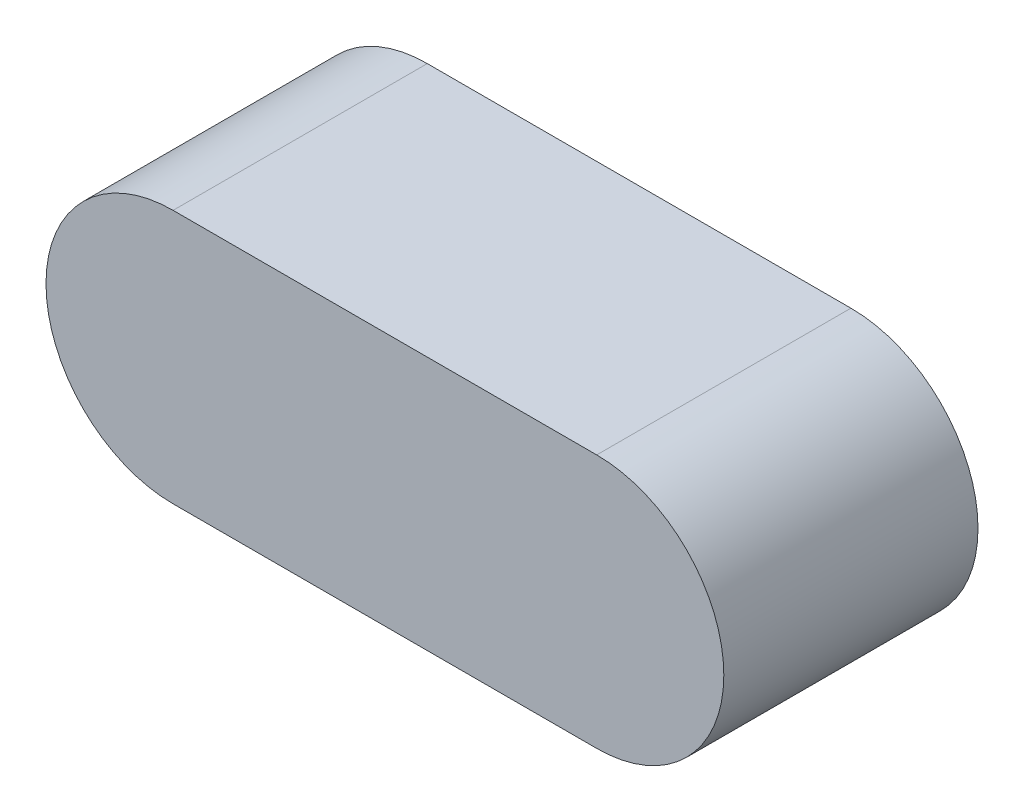
ISO-10303-21;
HEADER;
FILE_DESCRIPTION(('STEP AP214'),'2;1');
FILE_NAME('part.step','',(''),(''),'','','');
FILE_SCHEMA(('AUTOMOTIVE_DESIGN { 1 0 10303 214 1 1 1 1 }'));
ENDSEC;
DATA;
#1=APPLICATION_CONTEXT('core data for automotive mechanical design processes');
#2=APPLICATION_PROTOCOL_DEFINITION('international standard','automotive_design',2000,#1);
#3=PRODUCT_CONTEXT('',#1,'mechanical');
#4=PRODUCT('Part','Part','',(#3));
#5=PRODUCT_RELATED_PRODUCT_CATEGORY('part','',(#4));
#6=PRODUCT_DEFINITION_FORMATION('','',#4);
#7=PRODUCT_DEFINITION_CONTEXT('part definition',#1,'design');
#8=PRODUCT_DEFINITION('design','',#6,#7);
#9=PRODUCT_DEFINITION_SHAPE('','',#8);
#10=(LENGTH_UNIT() NAMED_UNIT(*) SI_UNIT(.MILLI.,.METRE.));
#11=(NAMED_UNIT(*) PLANE_ANGLE_UNIT() SI_UNIT($,.RADIAN.));
#12=(NAMED_UNIT(*) SI_UNIT($,.STERADIAN.) SOLID_ANGLE_UNIT());
#13=UNCERTAINTY_MEASURE_WITH_UNIT(LENGTH_MEASURE(1.E-05),#10,'distance_accuracy_value','');
#14=(GEOMETRIC_REPRESENTATION_CONTEXT(3) GLOBAL_UNCERTAINTY_ASSIGNED_CONTEXT((#13)) GLOBAL_UNIT_ASSIGNED_CONTEXT((#10,
#11,#12)) REPRESENTATION_CONTEXT('',''));
#15=CARTESIAN_POINT('',(0.,0.,0.));
#16=DIRECTION('',(0.,0.,1.));
#17=DIRECTION('',(1.,0.,0.));
#18=AXIS2_PLACEMENT_3D('',#15,#16,#17);
#19=CARTESIAN_POINT('',(-6.35,-4.7625,2.38125));
#20=DIRECTION('',(0.,1.,0.));
#21=DIRECTION('',(0.,0.,1.));
#22=AXIS2_PLACEMENT_3D('',#19,#20,#21);
#23=PLANE('',#22);
#24=DIRECTION('',(0.,0.,1.));
#25=VECTOR('',#24,1.);
#26=CARTESIAN_POINT('',(3.96875000000001,-4.76250000000001,-2.38125));
#27=LINE('',#26,#25);
#28=CARTESIAN_POINT('',(3.96875000000001,-4.76250000000001,-2.38125));
#29=VERTEX_POINT('',#28);
#30=CARTESIAN_POINT('',(3.96875000000001,-4.76250000000001,2.38125));
#31=VERTEX_POINT('',#30);
#32=EDGE_CURVE('E78',#29,#31,#27,.T.);
#33=ORIENTED_EDGE('',*,*,#32,.T.);
#34=DIRECTION('',(1.,0.,0.));
#35=VECTOR('',#34,1.);
#36=CARTESIAN_POINT('',(-6.35,-4.7625,2.38125));
#37=LINE('',#36,#35);
#38=CARTESIAN_POINT('',(-3.96875,-4.76250000000001,2.38125));
#39=VERTEX_POINT('',#38);
#40=EDGE_CURVE('E45',#39,#31,#37,.T.);
#41=ORIENTED_EDGE('',*,*,#40,.F.);
#42=DIRECTION('',(0.,0.,1.));
#43=VECTOR('',#42,1.);
#44=CARTESIAN_POINT('',(-3.96875,-4.76250000000001,-2.38125));
#45=LINE('',#44,#43);
#46=CARTESIAN_POINT('',(-3.96875,-4.76250000000001,-2.38125));
#47=VERTEX_POINT('',#46);
#48=EDGE_CURVE('E86',#47,#39,#45,.T.);
#49=ORIENTED_EDGE('',*,*,#48,.F.);
#50=DIRECTION('',(-1.,0.,0.));
#51=VECTOR('',#50,1.);
#52=CARTESIAN_POINT('',(-6.35,-4.7625,-2.38125));
#53=LINE('',#52,#51);
#54=EDGE_CURVE('E12',#29,#47,#53,.T.);
#55=ORIENTED_EDGE('',*,*,#54,.F.);
#56=EDGE_LOOP('',(#33,#41,#49,#55));
#57=FACE_BOUND('',#56,.T.);
#58=ADVANCED_FACE('F36',(#57),#23,.F.);
#59=CARTESIAN_POINT('',(-6.35,0.,2.38125));
#60=DIRECTION('',(0.,1.,0.));
#61=DIRECTION('',(0.,0.,1.));
#62=AXIS2_PLACEMENT_3D('',#59,#60,#61);
#63=PLANE('',#62);
#64=DIRECTION('',(1.,0.,0.));
#65=VECTOR('',#64,1.);
#66=CARTESIAN_POINT('',(-6.35,0.,2.38125));
#67=LINE('',#66,#65);
#68=CARTESIAN_POINT('',(-3.96875,0.,2.38125));
#69=VERTEX_POINT('',#68);
#70=CARTESIAN_POINT('',(3.96875000000001,0.,2.38125));
#71=VERTEX_POINT('',#70);
#72=EDGE_CURVE('E85',#69,#71,#67,.T.);
#73=ORIENTED_EDGE('',*,*,#72,.T.);
#74=DIRECTION('',(0.,0.,1.));
#75=VECTOR('',#74,1.);
#76=CARTESIAN_POINT('',(3.96875000000001,0.,-2.38125));
#77=LINE('',#76,#75);
#78=CARTESIAN_POINT('',(3.96875000000001,0.,-2.38125));
#79=VERTEX_POINT('',#78);
#80=EDGE_CURVE('E98',#79,#71,#77,.T.);
#81=ORIENTED_EDGE('',*,*,#80,.F.);
#82=DIRECTION('',(-1.,0.,0.));
#83=VECTOR('',#82,1.);
#84=CARTESIAN_POINT('',(-6.35,0.,-2.38125));
#85=LINE('',#84,#83);
#86=CARTESIAN_POINT('',(-3.96875,0.,-2.38125));
#87=VERTEX_POINT('',#86);
#88=EDGE_CURVE('E40',#79,#87,#85,.T.);
#89=ORIENTED_EDGE('',*,*,#88,.T.);
#90=DIRECTION('',(0.,0.,1.));
#91=VECTOR('',#90,1.);
#92=CARTESIAN_POINT('',(-3.96875,0.,-2.38125));
#93=LINE('',#92,#91);
#94=EDGE_CURVE('E96',#87,#69,#93,.T.);
#95=ORIENTED_EDGE('',*,*,#94,.T.);
#96=EDGE_LOOP('',(#73,#81,#89,#95));
#97=FACE_BOUND('',#96,.T.);
#98=ADVANCED_FACE('F105',(#97),#63,.T.);
#99=CARTESIAN_POINT('',(-6.35,-4.7625,-2.38125));
#100=DIRECTION('',(0.,0.,-1.));
#101=DIRECTION('',(-1.,0.,0.));
#102=AXIS2_PLACEMENT_3D('',#99,#100,#101);
#103=PLANE('',#102);
#104=CARTESIAN_POINT('',(3.96875000000001,-2.38125,-2.38125));
#105=DIRECTION('',(0.,0.,-1.));
#106=DIRECTION('',(-1.,0.,0.));
#107=AXIS2_PLACEMENT_3D('',#104,#105,#106);
#108=CIRCLE('',#107,2.38125);
#109=EDGE_CURVE('E53',#79,#29,#108,.T.);
#110=ORIENTED_EDGE('',*,*,#109,.T.);
#111=ORIENTED_EDGE('',*,*,#54,.T.);
#112=CARTESIAN_POINT('',(-3.96875,-2.38125,-2.38125));
#113=DIRECTION('',(0.,0.,-1.));
#114=DIRECTION('',(-1.,0.,0.));
#115=AXIS2_PLACEMENT_3D('',#112,#113,#114);
#116=CIRCLE('',#115,2.38125);
#117=EDGE_CURVE('E93',#47,#87,#116,.T.);
#118=ORIENTED_EDGE('',*,*,#117,.T.);
#119=ORIENTED_EDGE('',*,*,#88,.F.);
#120=EDGE_LOOP('',(#110,#111,#118,#119));
#121=FACE_BOUND('',#120,.T.);
#122=ADVANCED_FACE('F90',(#121),#103,.T.);
#123=CARTESIAN_POINT('',(-6.35,-4.7625,2.38125));
#124=DIRECTION('',(0.,0.,1.));
#125=DIRECTION('',(1.,0.,0.));
#126=AXIS2_PLACEMENT_3D('',#123,#124,#125);
#127=PLANE('',#126);
#128=CARTESIAN_POINT('',(3.96875000000001,-2.38125,2.38125));
#129=DIRECTION('',(0.,0.,-1.));
#130=DIRECTION('',(-1.,0.,0.));
#131=AXIS2_PLACEMENT_3D('',#128,#129,#130);
#132=CIRCLE('',#131,2.38125);
#133=EDGE_CURVE('E80',#71,#31,#132,.T.);
#134=ORIENTED_EDGE('',*,*,#133,.F.);
#135=ORIENTED_EDGE('',*,*,#72,.F.);
#136=CARTESIAN_POINT('',(-3.96875,-2.38125,2.38125));
#137=DIRECTION('',(0.,0.,-1.));
#138=DIRECTION('',(-1.,0.,0.));
#139=AXIS2_PLACEMENT_3D('',#136,#137,#138);
#140=CIRCLE('',#139,2.38125);
#141=EDGE_CURVE('E61',#39,#69,#140,.T.);
#142=ORIENTED_EDGE('',*,*,#141,.F.);
#143=ORIENTED_EDGE('',*,*,#40,.T.);
#144=EDGE_LOOP('',(#134,#135,#142,#143));
#145=FACE_BOUND('',#144,.T.);
#146=ADVANCED_FACE('F38',(#145),#127,.T.);
#147=CARTESIAN_POINT('',(-3.96875,-2.38125,-2.38125));
#148=DIRECTION('',(0.,0.,1.));
#149=DIRECTION('',(1.,0.,0.));
#150=AXIS2_PLACEMENT_3D('',#147,#148,#149);
#151=CYLINDRICAL_SURFACE('',#150,2.38125);
#152=ORIENTED_EDGE('',*,*,#141,.T.);
#153=ORIENTED_EDGE('',*,*,#94,.F.);
#154=ORIENTED_EDGE('',*,*,#117,.F.);
#155=ORIENTED_EDGE('',*,*,#48,.T.);
#156=EDGE_LOOP('',(#152,#153,#154,#155));
#157=FACE_BOUND('',#156,.T.);
#158=ADVANCED_FACE('F109',(#157),#151,.T.);
#159=CARTESIAN_POINT('',(3.96875000000001,-2.38125,-2.38125));
#160=DIRECTION('',(0.,0.,1.));
#161=DIRECTION('',(1.,0.,0.));
#162=AXIS2_PLACEMENT_3D('',#159,#160,#161);
#163=CYLINDRICAL_SURFACE('',#162,2.38125);
#164=ORIENTED_EDGE('',*,*,#133,.T.);
#165=ORIENTED_EDGE('',*,*,#32,.F.);
#166=ORIENTED_EDGE('',*,*,#109,.F.);
#167=ORIENTED_EDGE('',*,*,#80,.T.);
#168=EDGE_LOOP('',(#164,#165,#166,#167));
#169=FACE_BOUND('',#168,.T.);
#170=ADVANCED_FACE('F79',(#169),#163,.T.);
#171=CLOSED_SHELL('',(#58,#98,#122,#146,#158,#170));
#172=MANIFOLD_SOLID_BREP('B2',#171);
#173=ADVANCED_BREP_SHAPE_REPRESENTATION('',(#18,#172),#14);
#174=SHAPE_DEFINITION_REPRESENTATION(#9,#173);
ENDSEC;
END-ISO-10303-21;
